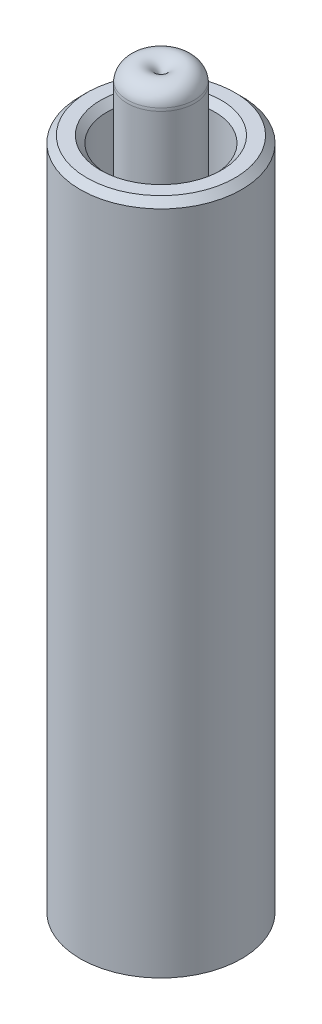
ISO-10303-21;
HEADER;
FILE_DESCRIPTION(('STEP AP214'),'2;1');
FILE_NAME('part.step','',(''),(''),'','','');
FILE_SCHEMA(('AUTOMOTIVE_DESIGN { 1 0 10303 214 1 1 1 1 }'));
ENDSEC;
DATA;
#1=APPLICATION_CONTEXT('core data for automotive mechanical design processes');
#2=APPLICATION_PROTOCOL_DEFINITION('international standard','automotive_design',2000,#1);
#3=PRODUCT_CONTEXT('',#1,'mechanical');
#4=PRODUCT('Part','Part','',(#3));
#5=PRODUCT_RELATED_PRODUCT_CATEGORY('part','',(#4));
#6=PRODUCT_DEFINITION_FORMATION('','',#4);
#7=PRODUCT_DEFINITION_CONTEXT('part definition',#1,'design');
#8=PRODUCT_DEFINITION('design','',#6,#7);
#9=PRODUCT_DEFINITION_SHAPE('','',#8);
#10=(LENGTH_UNIT() NAMED_UNIT(*) SI_UNIT(.MILLI.,.METRE.));
#11=(NAMED_UNIT(*) PLANE_ANGLE_UNIT() SI_UNIT($,.RADIAN.));
#12=(NAMED_UNIT(*) SI_UNIT($,.STERADIAN.) SOLID_ANGLE_UNIT());
#13=UNCERTAINTY_MEASURE_WITH_UNIT(LENGTH_MEASURE(1.E-05),#10,'distance_accuracy_value','');
#14=(GEOMETRIC_REPRESENTATION_CONTEXT(3) GLOBAL_UNCERTAINTY_ASSIGNED_CONTEXT((#13)) GLOBAL_UNIT_ASSIGNED_CONTEXT((#10,
#11,#12)) REPRESENTATION_CONTEXT('',''));
#15=CARTESIAN_POINT('',(0.,0.,0.));
#16=DIRECTION('',(0.,0.,1.));
#17=DIRECTION('',(1.,0.,0.));
#18=AXIS2_PLACEMENT_3D('',#15,#16,#17);
#19=CARTESIAN_POINT('',(0.,50.,0.));
#20=DIRECTION('',(0.,-1.,0.));
#21=DIRECTION('',(0.,0.,-1.));
#22=AXIS2_PLACEMENT_3D('',#19,#20,#21);
#23=CYLINDRICAL_SURFACE('',#22,6.);
#24=CARTESIAN_POINT('',(0.,49.5,0.));
#25=DIRECTION('',(0.,1.,0.));
#26=DIRECTION('',(0.,0.,1.));
#27=AXIS2_PLACEMENT_3D('',#24,#25,#26);
#28=CIRCLE('',#27,6.);
#29=CARTESIAN_POINT('',(0.,49.5,6.));
#30=VERTEX_POINT('',#29);
#31=EDGE_CURVE('E47',#30,#30,#28,.F.);
#32=ORIENTED_EDGE('',*,*,#31,.T.);
#33=EDGE_LOOP('',(#32));
#34=FACE_BOUND('',#33,.T.);
#35=CARTESIAN_POINT('',(0.,0.,0.));
#36=DIRECTION('',(0.,1.,0.));
#37=DIRECTION('',(0.,0.,1.));
#38=AXIS2_PLACEMENT_3D('',#35,#36,#37);
#39=CIRCLE('',#38,6.);
#40=CARTESIAN_POINT('',(0.,0.,6.));
#41=VERTEX_POINT('',#40);
#42=EDGE_CURVE('E69',#41,#41,#39,.T.);
#43=ORIENTED_EDGE('',*,*,#42,.T.);
#44=EDGE_LOOP('',(#43));
#45=FACE_BOUND('',#44,.T.);
#46=ADVANCED_FACE('F39',(#34,#45),#23,.T.);
#47=CARTESIAN_POINT('',(0.,50.,0.));
#48=DIRECTION('',(0.,1.,0.));
#49=DIRECTION('',(0.,0.,1.));
#50=AXIS2_PLACEMENT_3D('',#47,#48,#49);
#51=PLANE('',#50);
#52=CARTESIAN_POINT('',(0.,50.,0.));
#53=DIRECTION('',(0.,1.,0.));
#54=DIRECTION('',(0.,0.,1.));
#55=AXIS2_PLACEMENT_3D('',#52,#53,#54);
#56=CIRCLE('',#55,5.5);
#57=CARTESIAN_POINT('',(0.,50.,5.5));
#58=VERTEX_POINT('',#57);
#59=EDGE_CURVE('E51',#58,#58,#56,.T.);
#60=ORIENTED_EDGE('',*,*,#59,.T.);
#61=EDGE_LOOP('',(#60));
#62=FACE_BOUND('',#61,.T.);
#63=CARTESIAN_POINT('',(0.,50.,0.));
#64=DIRECTION('',(0.,1.,0.));
#65=DIRECTION('',(0.,0.,1.));
#66=AXIS2_PLACEMENT_3D('',#63,#64,#65);
#67=CIRCLE('',#66,4.5);
#68=CARTESIAN_POINT('',(0.,50.,4.5));
#69=VERTEX_POINT('',#68);
#70=EDGE_CURVE('E55',#69,#69,#67,.F.);
#71=ORIENTED_EDGE('',*,*,#70,.T.);
#72=EDGE_LOOP('',(#71));
#73=FACE_BOUND('',#72,.T.);
#74=ADVANCED_FACE('F100',(#62,#73),#51,.T.);
#75=CARTESIAN_POINT('',(0.,0.,0.));
#76=DIRECTION('',(0.,1.,0.));
#77=DIRECTION('',(0.,0.,1.));
#78=AXIS2_PLACEMENT_3D('',#75,#76,#77);
#79=PLANE('',#78);
#80=ORIENTED_EDGE('',*,*,#42,.F.);
#81=EDGE_LOOP('',(#80));
#82=FACE_BOUND('',#81,.T.);
#83=ADVANCED_FACE('F105',(#82),#79,.F.);
#84=CARTESIAN_POINT('',(0.,42.,0.));
#85=DIRECTION('',(0.,1.,0.));
#86=DIRECTION('',(0.,0.,1.));
#87=AXIS2_PLACEMENT_3D('',#84,#85,#86);
#88=CYLINDRICAL_SURFACE('',#87,4.);
#89=CARTESIAN_POINT('',(0.,49.5,0.));
#90=DIRECTION('',(0.,1.,0.));
#91=DIRECTION('',(0.,0.,1.));
#92=AXIS2_PLACEMENT_3D('',#89,#90,#91);
#93=CIRCLE('',#92,4.);
#94=CARTESIAN_POINT('',(0.,49.5,4.));
#95=VERTEX_POINT('',#94);
#96=EDGE_CURVE('E10',#95,#95,#93,.T.);
#97=ORIENTED_EDGE('',*,*,#96,.T.);
#98=EDGE_LOOP('',(#97));
#99=FACE_BOUND('',#98,.T.);
#100=CARTESIAN_POINT('',(0.,42.,0.));
#101=DIRECTION('',(0.,1.,0.));
#102=DIRECTION('',(0.,0.,1.));
#103=AXIS2_PLACEMENT_3D('',#100,#101,#102);
#104=CIRCLE('',#103,4.);
#105=CARTESIAN_POINT('',(0.,42.,4.));
#106=VERTEX_POINT('',#105);
#107=EDGE_CURVE('E72',#106,#106,#104,.T.);
#108=ORIENTED_EDGE('',*,*,#107,.F.);
#109=EDGE_LOOP('',(#108));
#110=FACE_BOUND('',#109,.T.);
#111=ADVANCED_FACE('F142',(#99,#110),#88,.F.);
#112=CARTESIAN_POINT('',(0.,42.,0.));
#113=DIRECTION('',(0.,1.,0.));
#114=DIRECTION('',(0.,0.,1.));
#115=AXIS2_PLACEMENT_3D('',#112,#113,#114);
#116=PLANE('',#115);
#117=CARTESIAN_POINT('',(0.,42.,0.));
#118=DIRECTION('',(0.,1.,0.));
#119=DIRECTION('',(0.,0.,1.));
#120=AXIS2_PLACEMENT_3D('',#117,#118,#119);
#121=CIRCLE('',#120,2.5);
#122=CARTESIAN_POINT('',(0.,42.,2.5));
#123=VERTEX_POINT('',#122);
#124=EDGE_CURVE('E75',#123,#123,#121,.T.);
#125=ORIENTED_EDGE('',*,*,#124,.F.);
#126=EDGE_LOOP('',(#125));
#127=FACE_BOUND('',#126,.T.);
#128=ORIENTED_EDGE('',*,*,#107,.T.);
#129=EDGE_LOOP('',(#128));
#130=FACE_BOUND('',#129,.T.);
#131=ADVANCED_FACE('F147',(#127,#130),#116,.T.);
#132=CARTESIAN_POINT('',(0.,42.,0.));
#133=DIRECTION('',(0.,1.,0.));
#134=DIRECTION('',(0.,0.,1.));
#135=AXIS2_PLACEMENT_3D('',#132,#133,#134);
#136=CYLINDRICAL_SURFACE('',#135,2.5);
#137=CARTESIAN_POINT('',(0.,53.3,0.));
#138=DIRECTION('',(0.,1.,0.));
#139=DIRECTION('',(0.,0.,1.));
#140=AXIS2_PLACEMENT_3D('',#137,#138,#139);
#141=CIRCLE('',#140,2.5);
#142=CARTESIAN_POINT('',(0.,53.3,2.5));
#143=VERTEX_POINT('',#142);
#144=EDGE_CURVE('E66',#143,#143,#141,.F.);
#145=ORIENTED_EDGE('',*,*,#144,.T.);
#146=EDGE_LOOP('',(#145));
#147=FACE_BOUND('',#146,.T.);
#148=ORIENTED_EDGE('',*,*,#124,.T.);
#149=EDGE_LOOP('',(#148));
#150=FACE_BOUND('',#149,.T.);
#151=ADVANCED_FACE('F95',(#147,#150),#136,.T.);
#152=CARTESIAN_POINT('',(0.,53.3,0.));
#153=DIRECTION('',(0.,1.,0.));
#154=DIRECTION('',(0.,0.,1.));
#155=AXIS2_PLACEMENT_3D('',#152,#153,#154);
#156=DEGENERATE_TOROIDAL_SURFACE('',#155,0.800000000000001,1.7,.T.);
#157=CARTESIAN_POINT('',(0.,53.5117270745264,0.));
#158=DIRECTION('',(0.,-1.,0.));
#159=DIRECTION('',(0.,0.,-1.));
#160=AXIS2_PLACEMENT_3D('',#157,#158,#159);
#161=CIRCLE('',#160,2.48676366036043);
#162=CARTESIAN_POINT('',(0.,53.5117270745264,-2.48676366036043));
#163=VERTEX_POINT('',#162);
#164=EDGE_CURVE('E60',#163,#163,#161,.T.);
#165=ORIENTED_EDGE('',*,*,#164,.T.);
#166=EDGE_LOOP('',(#165));
#167=FACE_BOUND('',#166,.T.);
#168=ORIENTED_EDGE('',*,*,#144,.F.);
#169=EDGE_LOOP('',(#168));
#170=FACE_BOUND('',#169,.T.);
#171=ADVANCED_FACE('F86',(#167,#170),#156,.T.);
#172=CARTESIAN_POINT('',(0.,50.,0.));
#173=DIRECTION('',(0.,1.,0.));
#174=DIRECTION('',(0.,0.,1.));
#175=AXIS2_PLACEMENT_3D('',#172,#173,#174);
#176=CYLINDRICAL_SURFACE('',#175,0.0961069589295417);
#177=CARTESIAN_POINT('',(0.,53.3622726689783,0.));
#178=DIRECTION('',(0.,-1.,0.));
#179=DIRECTION('',(0.,0.,-1.));
#180=AXIS2_PLACEMENT_3D('',#177,#178,#179);
#181=CIRCLE('',#180,0.0961069589295417);
#182=CARTESIAN_POINT('',(0.,53.3622726689783,-0.0961069589295417));
#183=VERTEX_POINT('',#182);
#184=EDGE_CURVE('E63',#183,#183,#181,.F.);
#185=ORIENTED_EDGE('',*,*,#184,.T.);
#186=EDGE_LOOP('',(#185));
#187=FACE_BOUND('',#186,.T.);
#188=CARTESIAN_POINT('',(0.,50.,0.));
#189=DIRECTION('',(0.,1.,0.));
#190=DIRECTION('',(0.,0.,1.));
#191=AXIS2_PLACEMENT_3D('',#188,#189,#190);
#192=CIRCLE('',#191,0.0961069589295417);
#193=CARTESIAN_POINT('',(0.,50.,0.0961069589295417));
#194=VERTEX_POINT('',#193);
#195=EDGE_CURVE('E78',#194,#194,#192,.T.);
#196=ORIENTED_EDGE('',*,*,#195,.F.);
#197=EDGE_LOOP('',(#196));
#198=FACE_BOUND('',#197,.T.);
#199=ADVANCED_FACE('F84',(#187,#198),#176,.F.);
#200=CARTESIAN_POINT('',(0.,50.,0.));
#201=DIRECTION('',(0.,1.,0.));
#202=DIRECTION('',(0.,0.,1.));
#203=AXIS2_PLACEMENT_3D('',#200,#201,#202);
#204=PLANE('',#203);
#205=ORIENTED_EDGE('',*,*,#195,.T.);
#206=EDGE_LOOP('',(#205));
#207=FACE_BOUND('',#206,.T.);
#208=ADVANCED_FACE('F82',(#207),#204,.T.);
#209=CARTESIAN_POINT('',(0.,53.3622726689783,0.));
#210=DIRECTION('',(0.,-1.,0.));
#211=DIRECTION('',(0.,0.,-1.));
#212=AXIS2_PLACEMENT_3D('',#209,#210,#211);
#213=TOROIDAL_SURFACE('',#212,1.29610695892954,1.2);
#214=ORIENTED_EDGE('',*,*,#164,.F.);
#215=EDGE_LOOP('',(#214));
#216=FACE_BOUND('',#215,.T.);
#217=ORIENTED_EDGE('',*,*,#184,.F.);
#218=EDGE_LOOP('',(#217));
#219=FACE_BOUND('',#218,.T.);
#220=ADVANCED_FACE('F93',(#216,#219),#213,.T.);
#221=CARTESIAN_POINT('',(0.,50.,0.));
#222=DIRECTION('',(0.,-1.,0.));
#223=DIRECTION('',(0.,0.,-1.));
#224=AXIS2_PLACEMENT_3D('',#221,#222,#223);
#225=CONICAL_SURFACE('',#224,5.5,0.785398163397451);
#226=ORIENTED_EDGE('',*,*,#31,.F.);
#227=EDGE_LOOP('',(#226));
#228=FACE_BOUND('',#227,.T.);
#229=ORIENTED_EDGE('',*,*,#59,.F.);
#230=EDGE_LOOP('',(#229));
#231=FACE_BOUND('',#230,.T.);
#232=ADVANCED_FACE('F112',(#228,#231),#225,.T.);
#233=CARTESIAN_POINT('',(0.,49.5,0.));
#234=DIRECTION('',(0.,1.,0.));
#235=DIRECTION('',(0.,0.,1.));
#236=AXIS2_PLACEMENT_3D('',#233,#234,#235);
#237=CONICAL_SURFACE('',#236,4.,0.785398163397444);
#238=ORIENTED_EDGE('',*,*,#70,.F.);
#239=EDGE_LOOP('',(#238));
#240=FACE_BOUND('',#239,.T.);
#241=ORIENTED_EDGE('',*,*,#96,.F.);
#242=EDGE_LOOP('',(#241));
#243=FACE_BOUND('',#242,.T.);
#244=ADVANCED_FACE('F42',(#240,#243),#237,.F.);
#245=CLOSED_SHELL('',(#46,#74,#83,#111,#131,#151,#171,#199,#208,#220,#232,#244));
#246=MANIFOLD_SOLID_BREP('B2',#245);
#247=ADVANCED_BREP_SHAPE_REPRESENTATION('',(#18,#246),#14);
#248=SHAPE_DEFINITION_REPRESENTATION(#9,#247);
ENDSEC;
END-ISO-10303-21;
